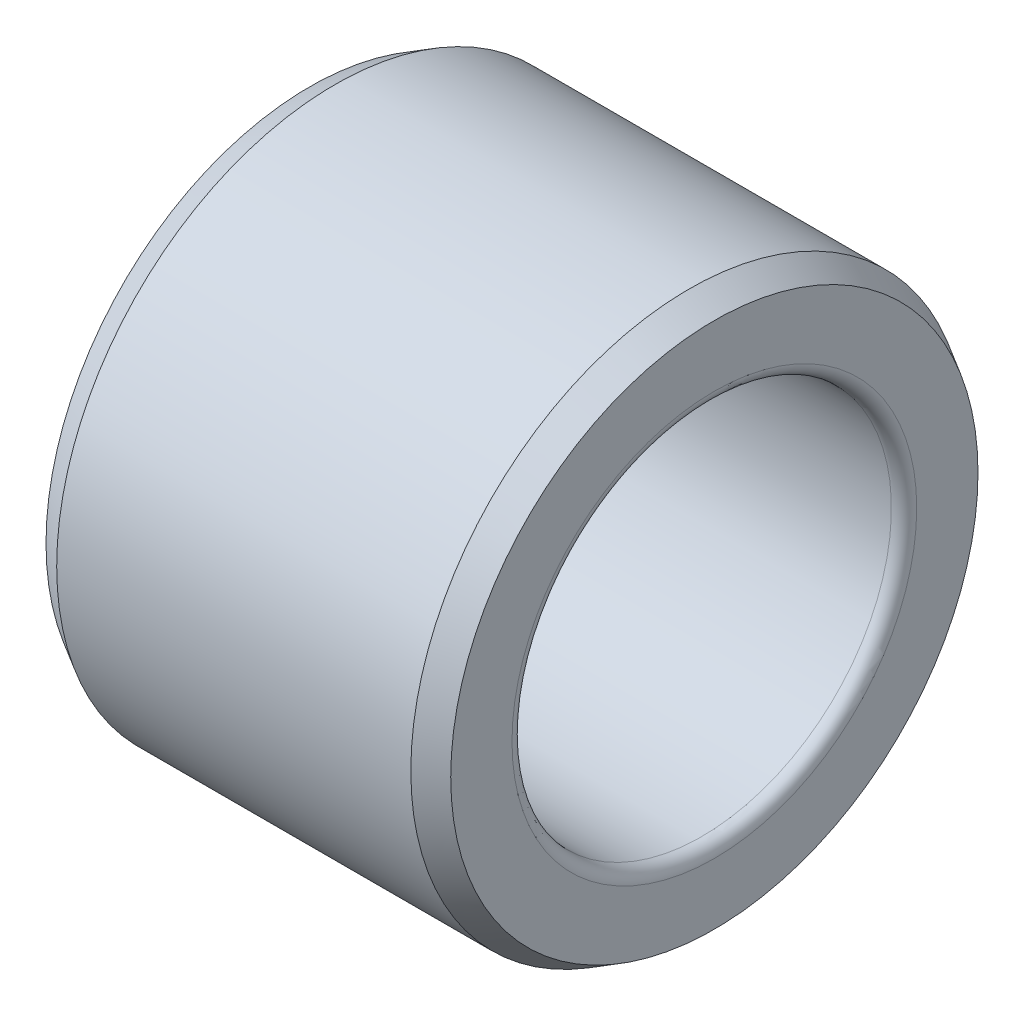
ISO-10303-21;
HEADER;
FILE_DESCRIPTION(('STEP AP214'),'2;1');
FILE_NAME('part.step','',(''),(''),'','','');
FILE_SCHEMA(('AUTOMOTIVE_DESIGN { 1 0 10303 214 1 1 1 1 }'));
ENDSEC;
DATA;
#1=APPLICATION_CONTEXT('core data for automotive mechanical design processes');
#2=APPLICATION_PROTOCOL_DEFINITION('international standard','automotive_design',2000,#1);
#3=PRODUCT_CONTEXT('',#1,'mechanical');
#4=PRODUCT('Part','Part','',(#3));
#5=PRODUCT_RELATED_PRODUCT_CATEGORY('part','',(#4));
#6=PRODUCT_DEFINITION_FORMATION('','',#4);
#7=PRODUCT_DEFINITION_CONTEXT('part definition',#1,'design');
#8=PRODUCT_DEFINITION('design','',#6,#7);
#9=PRODUCT_DEFINITION_SHAPE('','',#8);
#10=(LENGTH_UNIT() NAMED_UNIT(*) SI_UNIT(.MILLI.,.METRE.));
#11=(NAMED_UNIT(*) PLANE_ANGLE_UNIT() SI_UNIT($,.RADIAN.));
#12=(NAMED_UNIT(*) SI_UNIT($,.STERADIAN.) SOLID_ANGLE_UNIT());
#13=UNCERTAINTY_MEASURE_WITH_UNIT(LENGTH_MEASURE(1.E-05),#10,'distance_accuracy_value','');
#14=(GEOMETRIC_REPRESENTATION_CONTEXT(3) GLOBAL_UNCERTAINTY_ASSIGNED_CONTEXT((#13)) GLOBAL_UNIT_ASSIGNED_CONTEXT((#10,
#11,#12)) REPRESENTATION_CONTEXT('',''));
#15=CARTESIAN_POINT('',(0.,0.,0.));
#16=DIRECTION('',(0.,0.,1.));
#17=DIRECTION('',(1.,0.,0.));
#18=AXIS2_PLACEMENT_3D('',#15,#16,#17);
#19=CARTESIAN_POINT('',(0.,8.,0.));
#20=DIRECTION('',(1.,0.,0.));
#21=DIRECTION('',(0.,0.,-1.));
#22=AXIS2_PLACEMENT_3D('',#19,#20,#21);
#23=PLANE('',#22);
#24=CARTESIAN_POINT('',(0.,0.,0.));
#25=DIRECTION('',(1.,0.,0.));
#26=DIRECTION('',(0.,0.,-1.));
#27=AXIS2_PLACEMENT_3D('',#24,#25,#26);
#28=CIRCLE('',#27,10.4226497308104);
#29=CARTESIAN_POINT('',(0.,0.,-10.4226497308104));
#30=VERTEX_POINT('',#29);
#31=EDGE_CURVE('E10',#30,#30,#28,.F.);
#32=ORIENTED_EDGE('',*,*,#31,.T.);
#33=EDGE_LOOP('',(#32));
#34=FACE_BOUND('',#33,.T.);
#35=CARTESIAN_POINT('',(0.,0.,0.));
#36=DIRECTION('',(-1.,0.,0.));
#37=DIRECTION('',(0.,0.,1.));
#38=AXIS2_PLACEMENT_3D('',#35,#36,#37);
#39=CIRCLE('',#38,8.);
#40=CARTESIAN_POINT('',(0.,0.,8.));
#41=VERTEX_POINT('',#40);
#42=EDGE_CURVE('E59',#41,#41,#39,.T.);
#43=ORIENTED_EDGE('',*,*,#42,.F.);
#44=EDGE_LOOP('',(#43));
#45=FACE_BOUND('',#44,.T.);
#46=ADVANCED_FACE('F31',(#34,#45),#23,.F.);
#47=CARTESIAN_POINT('',(0.,0.,0.));
#48=DIRECTION('',(-1.,0.,0.));
#49=DIRECTION('',(0.,0.,1.));
#50=AXIS2_PLACEMENT_3D('',#47,#48,#49);
#51=CYLINDRICAL_SURFACE('',#50,11.);
#52=CARTESIAN_POINT('',(15.,0.,0.));
#53=DIRECTION('',(-1.,0.,0.));
#54=DIRECTION('',(0.,0.,1.));
#55=AXIS2_PLACEMENT_3D('',#52,#53,#54);
#56=CIRCLE('',#55,11.);
#57=CARTESIAN_POINT('',(15.,0.,11.));
#58=VERTEX_POINT('',#57);
#59=EDGE_CURVE('E41',#58,#58,#56,.T.);
#60=ORIENTED_EDGE('',*,*,#59,.T.);
#61=EDGE_LOOP('',(#60));
#62=FACE_BOUND('',#61,.T.);
#63=CARTESIAN_POINT('',(1.,0.,0.));
#64=DIRECTION('',(1.,0.,0.));
#65=DIRECTION('',(0.,0.,-1.));
#66=AXIS2_PLACEMENT_3D('',#63,#64,#65);
#67=CIRCLE('',#66,11.);
#68=CARTESIAN_POINT('',(1.,0.,-11.));
#69=VERTEX_POINT('',#68);
#70=EDGE_CURVE('E45',#69,#69,#67,.T.);
#71=ORIENTED_EDGE('',*,*,#70,.T.);
#72=EDGE_LOOP('',(#71));
#73=FACE_BOUND('',#72,.T.);
#74=ADVANCED_FACE('F66',(#62,#73),#51,.T.);
#75=CARTESIAN_POINT('',(16.,8.,0.));
#76=DIRECTION('',(-1.,0.,0.));
#77=DIRECTION('',(0.,0.,1.));
#78=AXIS2_PLACEMENT_3D('',#75,#76,#77);
#79=PLANE('',#78);
#80=CARTESIAN_POINT('',(16.,0.,0.));
#81=DIRECTION('',(-1.,0.,0.));
#82=DIRECTION('',(0.,0.,1.));
#83=AXIS2_PLACEMENT_3D('',#80,#81,#82);
#84=CIRCLE('',#83,10.4226497308104);
#85=CARTESIAN_POINT('',(16.,0.,10.4226497308104));
#86=VERTEX_POINT('',#85);
#87=EDGE_CURVE('E37',#86,#86,#84,.F.);
#88=ORIENTED_EDGE('',*,*,#87,.T.);
#89=EDGE_LOOP('',(#88));
#90=FACE_BOUND('',#89,.T.);
#91=CARTESIAN_POINT('',(16.,0.,0.));
#92=DIRECTION('',(-1.,0.,0.));
#93=DIRECTION('',(0.,0.,1.));
#94=AXIS2_PLACEMENT_3D('',#91,#92,#93);
#95=CIRCLE('',#94,8.);
#96=CARTESIAN_POINT('',(16.,0.,8.));
#97=VERTEX_POINT('',#96);
#98=EDGE_CURVE('E50',#97,#97,#95,.T.);
#99=ORIENTED_EDGE('',*,*,#98,.T.);
#100=EDGE_LOOP('',(#99));
#101=FACE_BOUND('',#100,.T.);
#102=ADVANCED_FACE('F70',(#90,#101),#79,.F.);
#103=CARTESIAN_POINT('',(15.5,0.,0.));
#104=DIRECTION('',(-1.,0.,0.));
#105=DIRECTION('',(0.,0.,1.));
#106=AXIS2_PLACEMENT_3D('',#103,#104,#105);
#107=TOROIDAL_SURFACE('',#106,8.,0.5);
#108=ORIENTED_EDGE('',*,*,#98,.F.);
#109=EDGE_LOOP('',(#108));
#110=FACE_BOUND('',#109,.T.);
#111=CARTESIAN_POINT('',(15.5,0.,0.));
#112=DIRECTION('',(-1.,0.,0.));
#113=DIRECTION('',(0.,0.,1.));
#114=AXIS2_PLACEMENT_3D('',#111,#112,#113);
#115=CIRCLE('',#114,7.5);
#116=CARTESIAN_POINT('',(15.5,0.,7.5));
#117=VERTEX_POINT('',#116);
#118=EDGE_CURVE('E53',#117,#117,#115,.T.);
#119=ORIENTED_EDGE('',*,*,#118,.T.);
#120=EDGE_LOOP('',(#119));
#121=FACE_BOUND('',#120,.T.);
#122=ADVANCED_FACE('F75',(#110,#121),#107,.T.);
#123=CARTESIAN_POINT('',(0.,0.,0.));
#124=DIRECTION('',(-1.,0.,0.));
#125=DIRECTION('',(0.,0.,1.));
#126=AXIS2_PLACEMENT_3D('',#123,#124,#125);
#127=CYLINDRICAL_SURFACE('',#126,7.5);
#128=ORIENTED_EDGE('',*,*,#118,.F.);
#129=EDGE_LOOP('',(#128));
#130=FACE_BOUND('',#129,.T.);
#131=CARTESIAN_POINT('',(0.500000000000003,0.,0.));
#132=DIRECTION('',(-1.,0.,0.));
#133=DIRECTION('',(0.,0.,1.));
#134=AXIS2_PLACEMENT_3D('',#131,#132,#133);
#135=CIRCLE('',#134,7.5);
#136=CARTESIAN_POINT('',(0.500000000000003,0.,7.5));
#137=VERTEX_POINT('',#136);
#138=EDGE_CURVE('E56',#137,#137,#135,.T.);
#139=ORIENTED_EDGE('',*,*,#138,.T.);
#140=EDGE_LOOP('',(#139));
#141=FACE_BOUND('',#140,.T.);
#142=ADVANCED_FACE('F81',(#130,#141),#127,.F.);
#143=CARTESIAN_POINT('',(0.5,0.,0.));
#144=DIRECTION('',(-1.,0.,0.));
#145=DIRECTION('',(0.,0.,1.));
#146=AXIS2_PLACEMENT_3D('',#143,#144,#145);
#147=TOROIDAL_SURFACE('',#146,8.,0.5);
#148=ORIENTED_EDGE('',*,*,#138,.F.);
#149=EDGE_LOOP('',(#148));
#150=FACE_BOUND('',#149,.T.);
#151=ORIENTED_EDGE('',*,*,#42,.T.);
#152=EDGE_LOOP('',(#151));
#153=FACE_BOUND('',#152,.T.);
#154=ADVANCED_FACE('F63',(#150,#153),#147,.T.);
#155=CARTESIAN_POINT('',(15.,0.,0.));
#156=DIRECTION('',(-1.,0.,0.));
#157=DIRECTION('',(0.,0.,1.));
#158=AXIS2_PLACEMENT_3D('',#155,#156,#157);
#159=CONICAL_SURFACE('',#158,11.,0.523598775598305);
#160=ORIENTED_EDGE('',*,*,#87,.F.);
#161=EDGE_LOOP('',(#160));
#162=FACE_BOUND('',#161,.T.);
#163=ORIENTED_EDGE('',*,*,#59,.F.);
#164=EDGE_LOOP('',(#163));
#165=FACE_BOUND('',#164,.T.);
#166=ADVANCED_FACE('F88',(#162,#165),#159,.T.);
#167=CARTESIAN_POINT('',(0.,0.,0.));
#168=DIRECTION('',(1.,0.,0.));
#169=DIRECTION('',(0.,0.,-1.));
#170=AXIS2_PLACEMENT_3D('',#167,#168,#169);
#171=CONICAL_SURFACE('',#170,10.4226497308104,0.523598775598305);
#172=ORIENTED_EDGE('',*,*,#70,.F.);
#173=EDGE_LOOP('',(#172));
#174=FACE_BOUND('',#173,.T.);
#175=ORIENTED_EDGE('',*,*,#31,.F.);
#176=EDGE_LOOP('',(#175));
#177=FACE_BOUND('',#176,.T.);
#178=ADVANCED_FACE('F92',(#174,#177),#171,.T.);
#179=CLOSED_SHELL('',(#46,#74,#102,#122,#142,#154,#166,#178));
#180=MANIFOLD_SOLID_BREP('B2',#179);
#181=ADVANCED_BREP_SHAPE_REPRESENTATION('',(#18,#180),#14);
#182=SHAPE_DEFINITION_REPRESENTATION(#9,#181);
ENDSEC;
END-ISO-10303-21;
